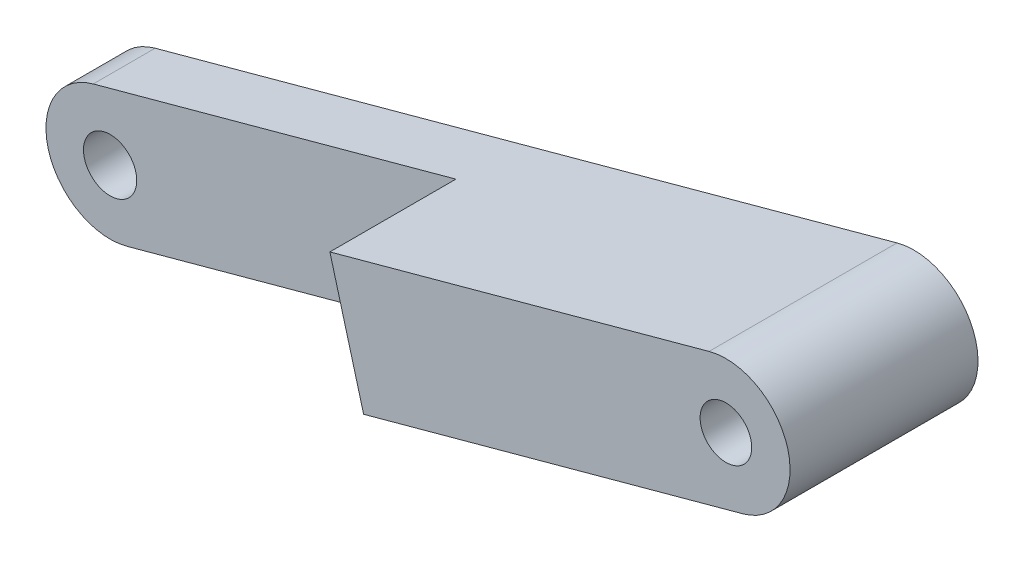
ISO-10303-21;
HEADER;
FILE_DESCRIPTION(('STEP AP214'),'2;1');
FILE_NAME('part.step','',(''),(''),'','','');
FILE_SCHEMA(('AUTOMOTIVE_DESIGN { 1 0 10303 214 1 1 1 1 }'));
ENDSEC;
DATA;
#1=APPLICATION_CONTEXT('core data for automotive mechanical design processes');
#2=APPLICATION_PROTOCOL_DEFINITION('international standard','automotive_design',2000,#1);
#3=PRODUCT_CONTEXT('',#1,'mechanical');
#4=PRODUCT('Part','Part','',(#3));
#5=PRODUCT_RELATED_PRODUCT_CATEGORY('part','',(#4));
#6=PRODUCT_DEFINITION_FORMATION('','',#4);
#7=PRODUCT_DEFINITION_CONTEXT('part definition',#1,'design');
#8=PRODUCT_DEFINITION('design','',#6,#7);
#9=PRODUCT_DEFINITION_SHAPE('','',#8);
#10=(LENGTH_UNIT() NAMED_UNIT(*) SI_UNIT(.MILLI.,.METRE.));
#11=(NAMED_UNIT(*) PLANE_ANGLE_UNIT() SI_UNIT($,.RADIAN.));
#12=(NAMED_UNIT(*) SI_UNIT($,.STERADIAN.) SOLID_ANGLE_UNIT());
#13=UNCERTAINTY_MEASURE_WITH_UNIT(LENGTH_MEASURE(1.E-05),#10,'distance_accuracy_value','');
#14=(GEOMETRIC_REPRESENTATION_CONTEXT(3) GLOBAL_UNCERTAINTY_ASSIGNED_CONTEXT((#13)) GLOBAL_UNIT_ASSIGNED_CONTEXT((#10,
#11,#12)) REPRESENTATION_CONTEXT('',''));
#15=CARTESIAN_POINT('',(0.,0.,0.));
#16=DIRECTION('',(0.,0.,1.));
#17=DIRECTION('',(1.,0.,0.));
#18=AXIS2_PLACEMENT_3D('',#15,#16,#17);
#19=CARTESIAN_POINT('',(-26.5992706705163,1.16732875529379,11.));
#20=DIRECTION('',(0.,0.,1.));
#21=DIRECTION('',(1.,0.,0.));
#22=AXIS2_PLACEMENT_3D('',#19,#20,#21);
#23=PLANE('',#22);
#24=DIRECTION('',(-0.263103507286984,0.964767611631572,0.));
#25=VECTOR('',#24,1.);
#26=CARTESIAN_POINT('',(-3.73092240834269,0.929240956684993,11.));
#27=LINE('',#26,#25);
#28=CARTESIAN_POINT('',(-4.38680894803083,3.33429475821417,11.));
#29=VERTEX_POINT('',#28);
#30=CARTESIAN_POINT('',(-6.36195748121254,10.5769170730007,11.));
#31=VERTEX_POINT('',#30);
#32=EDGE_CURVE('E50',#29,#31,#27,.T.);
#33=ORIENTED_EDGE('',*,*,#32,.F.);
#34=DIRECTION('',(0.964767611631572,0.263103507286984,0.));
#35=VECTOR('',#34,1.);
#36=CARTESIAN_POINT('',(-25.6116964039254,-2.45398240209948,11.));
#37=LINE('',#36,#35);
#38=CARTESIAN_POINT('',(17.8028461194953,9.3856754258148,11.));
#39=VERTEX_POINT('',#38);
#40=EDGE_CURVE('E98',#29,#39,#37,.T.);
#41=ORIENTED_EDGE('',*,*,#40,.T.);
#42=CARTESIAN_POINT('',(16.8152718529045,13.0069865832081,11.));
#43=DIRECTION('',(0.,0.,1.));
#44=DIRECTION('',(1.,0.,0.));
#45=AXIS2_PLACEMENT_3D('',#42,#43,#44);
#46=CIRCLE('',#45,3.75355796953949);
#47=CARTESIAN_POINT('',(15.8276975863136,16.6282977406013,11.));
#48=VERTEX_POINT('',#47);
#49=EDGE_CURVE('E59',#39,#48,#46,.T.);
#50=ORIENTED_EDGE('',*,*,#49,.T.);
#51=DIRECTION('',(-0.964767611631572,-0.263103507286984,0.));
#52=VECTOR('',#51,1.);
#53=CARTESIAN_POINT('',(-27.5868449371071,4.78863991268707,11.));
#54=LINE('',#53,#52);
#55=EDGE_CURVE('E89',#48,#31,#54,.T.);
#56=ORIENTED_EDGE('',*,*,#55,.T.);
#57=EDGE_LOOP('',(#33,#41,#50,#56));
#58=FACE_BOUND('',#57,.T.);
#59=CARTESIAN_POINT('',(16.8152718529045,13.0069865832081,11.));
#60=DIRECTION('',(0.,0.,1.));
#61=DIRECTION('',(1.,0.,0.));
#62=AXIS2_PLACEMENT_3D('',#59,#60,#61);
#63=CIRCLE('',#62,1.51073458410482);
#64=CARTESIAN_POINT('',(18.3260064370093,13.0069865832081,11.));
#65=VERTEX_POINT('',#64);
#66=EDGE_CURVE('E109',#65,#65,#63,.T.);
#67=ORIENTED_EDGE('',*,*,#66,.F.);
#68=EDGE_LOOP('',(#67));
#69=FACE_BOUND('',#68,.T.);
#70=ADVANCED_FACE('F34',(#58,#69),#23,.T.);
#71=CARTESIAN_POINT('',(-26.5992706705163,1.16732875529379,0.));
#72=DIRECTION('',(0.,0.,1.));
#73=DIRECTION('',(1.,0.,0.));
#74=AXIS2_PLACEMENT_3D('',#71,#72,#73);
#75=PLANE('',#74);
#76=CARTESIAN_POINT('',(-26.5992706705163,1.16732875529379,0.));
#77=DIRECTION('',(0.,0.,1.));
#78=DIRECTION('',(1.,0.,0.));
#79=AXIS2_PLACEMENT_3D('',#76,#77,#78);
#80=CIRCLE('',#79,3.7535579695395);
#81=CARTESIAN_POINT('',(-27.5868449371071,4.78863991268707,0.));
#82=VERTEX_POINT('',#81);
#83=CARTESIAN_POINT('',(-25.6116964039254,-2.45398240209948,0.));
#84=VERTEX_POINT('',#83);
#85=EDGE_CURVE('E82',#82,#84,#80,.T.);
#86=ORIENTED_EDGE('',*,*,#85,.F.);
#87=DIRECTION('',(-0.964767611631572,-0.263103507286984,0.));
#88=VECTOR('',#87,1.);
#89=CARTESIAN_POINT('',(-27.5868449371071,4.78863991268707,0.));
#90=LINE('',#89,#88);
#91=CARTESIAN_POINT('',(15.8276975863136,16.6282977406013,0.));
#92=VERTEX_POINT('',#91);
#93=EDGE_CURVE('E93',#92,#82,#90,.T.);
#94=ORIENTED_EDGE('',*,*,#93,.F.);
#95=CARTESIAN_POINT('',(16.8152718529045,13.0069865832081,0.));
#96=DIRECTION('',(0.,0.,1.));
#97=DIRECTION('',(1.,0.,0.));
#98=AXIS2_PLACEMENT_3D('',#95,#96,#97);
#99=CIRCLE('',#98,3.75355796953949);
#100=CARTESIAN_POINT('',(17.8028461194953,9.3856754258148,0.));
#101=VERTEX_POINT('',#100);
#102=EDGE_CURVE('E99',#101,#92,#99,.T.);
#103=ORIENTED_EDGE('',*,*,#102,.F.);
#104=DIRECTION('',(0.964767611631572,0.263103507286984,0.));
#105=VECTOR('',#104,1.);
#106=CARTESIAN_POINT('',(-25.6116964039254,-2.45398240209948,0.));
#107=LINE('',#106,#105);
#108=EDGE_CURVE('E104',#84,#101,#107,.T.);
#109=ORIENTED_EDGE('',*,*,#108,.F.);
#110=EDGE_LOOP('',(#86,#94,#103,#109));
#111=FACE_BOUND('',#110,.T.);
#112=CARTESIAN_POINT('',(-26.5992706705163,1.16732875529379,0.));
#113=DIRECTION('',(0.,0.,1.));
#114=DIRECTION('',(1.,0.,0.));
#115=AXIS2_PLACEMENT_3D('',#112,#113,#114);
#116=CIRCLE('',#115,1.55867170883807);
#117=CARTESIAN_POINT('',(-25.0405989616782,1.16732875529379,0.));
#118=VERTEX_POINT('',#117);
#119=EDGE_CURVE('E105',#118,#118,#116,.T.);
#120=ORIENTED_EDGE('',*,*,#119,.T.);
#121=EDGE_LOOP('',(#120));
#122=FACE_BOUND('',#121,.T.);
#123=CARTESIAN_POINT('',(16.8152718529045,13.0069865832081,0.));
#124=DIRECTION('',(0.,0.,1.));
#125=DIRECTION('',(1.,0.,0.));
#126=AXIS2_PLACEMENT_3D('',#123,#124,#125);
#127=CIRCLE('',#126,1.51073458410482);
#128=CARTESIAN_POINT('',(18.3260064370093,13.0069865832081,0.));
#129=VERTEX_POINT('',#128);
#130=EDGE_CURVE('E152',#129,#129,#127,.T.);
#131=ORIENTED_EDGE('',*,*,#130,.T.);
#132=EDGE_LOOP('',(#131));
#133=FACE_BOUND('',#132,.T.);
#134=ADVANCED_FACE('F102',(#111,#122,#133),#75,.F.);
#135=CARTESIAN_POINT('',(-26.5992706705163,1.16732875529379,11.));
#136=DIRECTION('',(0.,0.,-1.));
#137=DIRECTION('',(-1.,0.,0.));
#138=AXIS2_PLACEMENT_3D('',#135,#136,#137);
#139=CYLINDRICAL_SURFACE('',#138,3.7535579695395);
#140=DIRECTION('',(0.,0.,-1.));
#141=VECTOR('',#140,1.);
#142=CARTESIAN_POINT('',(-25.6116964039254,-2.45398240209948,11.));
#143=LINE('',#142,#141);
#144=CARTESIAN_POINT('',(-25.6116964039254,-2.45398240209948,3.62321941802581));
#145=VERTEX_POINT('',#144);
#146=EDGE_CURVE('E11',#145,#84,#143,.T.);
#147=ORIENTED_EDGE('',*,*,#146,.F.);
#148=CARTESIAN_POINT('',(-26.5992706705163,1.16732875529379,3.62321941802581));
#149=DIRECTION('',(0.,0.,-1.));
#150=DIRECTION('',(-1.,0.,0.));
#151=AXIS2_PLACEMENT_3D('',#148,#149,#150);
#152=CIRCLE('',#151,3.7535579695395);
#153=CARTESIAN_POINT('',(-27.5868449371071,4.78863991268707,3.62321941802581));
#154=VERTEX_POINT('',#153);
#155=EDGE_CURVE('E85',#145,#154,#152,.T.);
#156=ORIENTED_EDGE('',*,*,#155,.T.);
#157=DIRECTION('',(0.,0.,-1.));
#158=VECTOR('',#157,1.);
#159=CARTESIAN_POINT('',(-27.5868449371071,4.78863991268707,11.));
#160=LINE('',#159,#158);
#161=EDGE_CURVE('E78',#154,#82,#160,.T.);
#162=ORIENTED_EDGE('',*,*,#161,.T.);
#163=ORIENTED_EDGE('',*,*,#85,.T.);
#164=EDGE_LOOP('',(#147,#156,#162,#163));
#165=FACE_BOUND('',#164,.T.);
#166=ADVANCED_FACE('F36',(#165),#139,.T.);
#167=CARTESIAN_POINT('',(-25.6116964039254,-2.45398240209948,11.));
#168=DIRECTION('',(-0.263103507286984,0.964767611631572,0.));
#169=DIRECTION('',(-0.964767611631572,-0.263103507286984,0.));
#170=AXIS2_PLACEMENT_3D('',#167,#168,#169);
#171=PLANE('',#170);
#172=DIRECTION('',(0.,0.,-1.));
#173=VECTOR('',#172,1.);
#174=CARTESIAN_POINT('',(-4.38680894803083,3.33429475821417,11.));
#175=LINE('',#174,#173);
#176=CARTESIAN_POINT('',(-4.38680894803083,3.33429475821417,3.62321941802581));
#177=VERTEX_POINT('',#176);
#178=EDGE_CURVE('E150',#29,#177,#175,.T.);
#179=ORIENTED_EDGE('',*,*,#178,.T.);
#180=DIRECTION('',(-0.964767611631572,-0.263103507286984,0.));
#181=VECTOR('',#180,1.);
#182=CARTESIAN_POINT('',(-25.6116964039254,-2.45398240209948,3.62321941802581));
#183=LINE('',#182,#181);
#184=EDGE_CURVE('E127',#177,#145,#183,.T.);
#185=ORIENTED_EDGE('',*,*,#184,.T.);
#186=ORIENTED_EDGE('',*,*,#146,.T.);
#187=ORIENTED_EDGE('',*,*,#108,.T.);
#188=DIRECTION('',(0.,0.,-1.));
#189=VECTOR('',#188,1.);
#190=CARTESIAN_POINT('',(17.8028461194953,9.3856754258148,11.));
#191=LINE('',#190,#189);
#192=EDGE_CURVE('E43',#39,#101,#191,.T.);
#193=ORIENTED_EDGE('',*,*,#192,.F.);
#194=ORIENTED_EDGE('',*,*,#40,.F.);
#195=EDGE_LOOP('',(#179,#185,#186,#187,#193,#194));
#196=FACE_BOUND('',#195,.T.);
#197=ADVANCED_FACE('F123',(#196),#171,.F.);
#198=CARTESIAN_POINT('',(16.8152718529045,13.0069865832081,11.));
#199=DIRECTION('',(0.,0.,-1.));
#200=DIRECTION('',(-1.,0.,0.));
#201=AXIS2_PLACEMENT_3D('',#198,#199,#200);
#202=CYLINDRICAL_SURFACE('',#201,3.75355796953949);
#203=ORIENTED_EDGE('',*,*,#102,.T.);
#204=DIRECTION('',(0.,0.,-1.));
#205=VECTOR('',#204,1.);
#206=CARTESIAN_POINT('',(15.8276975863136,16.6282977406013,11.));
#207=LINE('',#206,#205);
#208=EDGE_CURVE('E88',#48,#92,#207,.T.);
#209=ORIENTED_EDGE('',*,*,#208,.F.);
#210=ORIENTED_EDGE('',*,*,#49,.F.);
#211=ORIENTED_EDGE('',*,*,#192,.T.);
#212=EDGE_LOOP('',(#203,#209,#210,#211));
#213=FACE_BOUND('',#212,.T.);
#214=ADVANCED_FACE('F119',(#213),#202,.T.);
#215=CARTESIAN_POINT('',(-27.5868449371071,4.78863991268707,11.));
#216=DIRECTION('',(0.263103507286984,-0.964767611631572,0.));
#217=DIRECTION('',(0.964767611631572,0.263103507286984,0.));
#218=AXIS2_PLACEMENT_3D('',#215,#216,#217);
#219=PLANE('',#218);
#220=ORIENTED_EDGE('',*,*,#161,.F.);
#221=DIRECTION('',(-0.964767611631572,-0.263103507286984,0.));
#222=VECTOR('',#221,1.);
#223=CARTESIAN_POINT('',(-35.3049858301597,2.6838118543912,3.62321941802581));
#224=LINE('',#223,#222);
#225=CARTESIAN_POINT('',(-6.36195748121253,10.5769170730007,3.62321941802581));
#226=VERTEX_POINT('',#225);
#227=EDGE_CURVE('E140',#226,#154,#224,.T.);
#228=ORIENTED_EDGE('',*,*,#227,.F.);
#229=DIRECTION('',(0.,0.,-1.));
#230=VECTOR('',#229,1.);
#231=CARTESIAN_POINT('',(-6.36195748121253,10.5769170730007,11.));
#232=LINE('',#231,#230);
#233=EDGE_CURVE('E142',#31,#226,#232,.T.);
#234=ORIENTED_EDGE('',*,*,#233,.F.);
#235=ORIENTED_EDGE('',*,*,#55,.F.);
#236=ORIENTED_EDGE('',*,*,#208,.T.);
#237=ORIENTED_EDGE('',*,*,#93,.T.);
#238=EDGE_LOOP('',(#220,#228,#234,#235,#236,#237));
#239=FACE_BOUND('',#238,.T.);
#240=ADVANCED_FACE('F94',(#239),#219,.F.);
#241=CARTESIAN_POINT('',(-26.5992706705163,1.16732875529379,11.));
#242=DIRECTION('',(0.,0.,-1.));
#243=DIRECTION('',(-1.,0.,0.));
#244=AXIS2_PLACEMENT_3D('',#241,#242,#243);
#245=CYLINDRICAL_SURFACE('',#244,1.55867170883807);
#246=CARTESIAN_POINT('',(-26.5992706705163,1.16732875529379,3.62321941802581));
#247=DIRECTION('',(0.,0.,-1.));
#248=DIRECTION('',(-1.,0.,0.));
#249=AXIS2_PLACEMENT_3D('',#246,#247,#248);
#250=CIRCLE('',#249,1.55867170883807);
#251=CARTESIAN_POINT('',(-28.1579423793543,1.16732875529379,3.62321941802581));
#252=VERTEX_POINT('',#251);
#253=EDGE_CURVE('E38',#252,#252,#250,.T.);
#254=ORIENTED_EDGE('',*,*,#253,.F.);
#255=EDGE_LOOP('',(#254));
#256=FACE_BOUND('',#255,.T.);
#257=ORIENTED_EDGE('',*,*,#119,.F.);
#258=EDGE_LOOP('',(#257));
#259=FACE_BOUND('',#258,.T.);
#260=ADVANCED_FACE('F165',(#256,#259),#245,.F.);
#261=CARTESIAN_POINT('',(16.8152718529045,13.0069865832081,11.));
#262=DIRECTION('',(0.,0.,-1.));
#263=DIRECTION('',(-1.,0.,0.));
#264=AXIS2_PLACEMENT_3D('',#261,#262,#263);
#265=CYLINDRICAL_SURFACE('',#264,1.51073458410482);
#266=ORIENTED_EDGE('',*,*,#66,.T.);
#267=EDGE_LOOP('',(#266));
#268=FACE_BOUND('',#267,.T.);
#269=ORIENTED_EDGE('',*,*,#130,.F.);
#270=EDGE_LOOP('',(#269));
#271=FACE_BOUND('',#270,.T.);
#272=ADVANCED_FACE('F162',(#268,#271),#265,.F.);
#273=CARTESIAN_POINT('',(-3.73092240834269,0.929240956684993,11.));
#274=DIRECTION('',(0.964767611631572,0.263103507286984,0.));
#275=DIRECTION('',(-0.263103507286984,0.964767611631572,0.));
#276=AXIS2_PLACEMENT_3D('',#273,#274,#275);
#277=PLANE('',#276);
#278=ORIENTED_EDGE('',*,*,#32,.T.);
#279=ORIENTED_EDGE('',*,*,#233,.T.);
#280=DIRECTION('',(-0.263103507286984,0.964767611631572,0.));
#281=VECTOR('',#280,1.);
#282=CARTESIAN_POINT('',(-3.73092240834269,0.929240956684993,3.62321941802581));
#283=LINE('',#282,#281);
#284=EDGE_CURVE('E138',#177,#226,#283,.T.);
#285=ORIENTED_EDGE('',*,*,#284,.F.);
#286=ORIENTED_EDGE('',*,*,#178,.F.);
#287=EDGE_LOOP('',(#278,#279,#285,#286));
#288=FACE_BOUND('',#287,.T.);
#289=ADVANCED_FACE('F143',(#288),#277,.F.);
#290=CARTESIAN_POINT('',(-32.6739507572899,-6.96386426192452,3.62321941802581));
#291=DIRECTION('',(0.,0.,-1.));
#292=DIRECTION('',(-1.,0.,0.));
#293=AXIS2_PLACEMENT_3D('',#290,#291,#292);
#294=PLANE('',#293);
#295=ORIENTED_EDGE('',*,*,#253,.T.);
#296=EDGE_LOOP('',(#295));
#297=FACE_BOUND('',#296,.T.);
#298=ORIENTED_EDGE('',*,*,#184,.F.);
#299=ORIENTED_EDGE('',*,*,#284,.T.);
#300=ORIENTED_EDGE('',*,*,#227,.T.);
#301=ORIENTED_EDGE('',*,*,#155,.F.);
#302=EDGE_LOOP('',(#298,#299,#300,#301));
#303=FACE_BOUND('',#302,.T.);
#304=ADVANCED_FACE('F139',(#297,#303),#294,.F.);
#305=CLOSED_SHELL('',(#70,#134,#166,#197,#214,#240,#260,#272,#289,#304));
#306=MANIFOLD_SOLID_BREP('B2',#305);
#307=ADVANCED_BREP_SHAPE_REPRESENTATION('',(#18,#306),#14);
#308=SHAPE_DEFINITION_REPRESENTATION(#9,#307);
ENDSEC;
END-ISO-10303-21;
